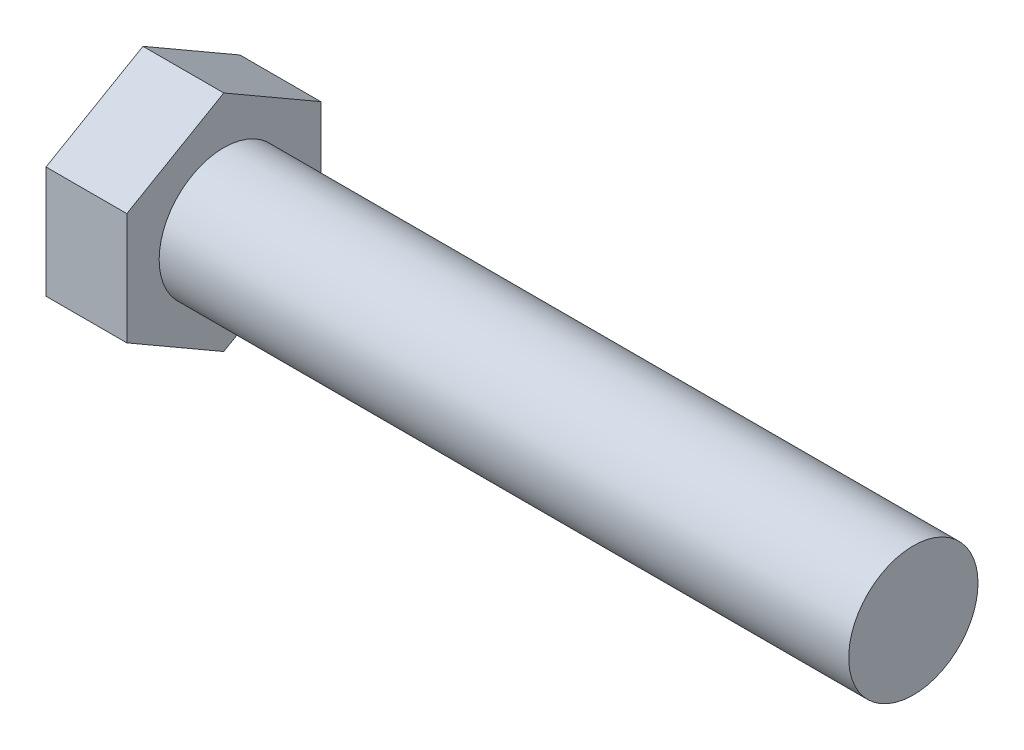
ISO-10303-21;
HEADER;
FILE_DESCRIPTION(('STEP AP214'),'2;1');
FILE_NAME('part.step','',(''),(''),'','','');
FILE_SCHEMA(('AUTOMOTIVE_DESIGN { 1 0 10303 214 1 1 1 1 }'));
ENDSEC;
DATA;
#1=APPLICATION_CONTEXT('core data for automotive mechanical design processes');
#2=APPLICATION_PROTOCOL_DEFINITION('international standard','automotive_design',2000,#1);
#3=PRODUCT_CONTEXT('',#1,'mechanical');
#4=PRODUCT('Part','Part','',(#3));
#5=PRODUCT_RELATED_PRODUCT_CATEGORY('part','',(#4));
#6=PRODUCT_DEFINITION_FORMATION('','',#4);
#7=PRODUCT_DEFINITION_CONTEXT('part definition',#1,'design');
#8=PRODUCT_DEFINITION('design','',#6,#7);
#9=PRODUCT_DEFINITION_SHAPE('','',#8);
#10=(LENGTH_UNIT() NAMED_UNIT(*) SI_UNIT(.MILLI.,.METRE.));
#11=(NAMED_UNIT(*) PLANE_ANGLE_UNIT() SI_UNIT($,.RADIAN.));
#12=(NAMED_UNIT(*) SI_UNIT($,.STERADIAN.) SOLID_ANGLE_UNIT());
#13=UNCERTAINTY_MEASURE_WITH_UNIT(LENGTH_MEASURE(1.E-05),#10,'distance_accuracy_value','');
#14=(GEOMETRIC_REPRESENTATION_CONTEXT(3) GLOBAL_UNCERTAINTY_ASSIGNED_CONTEXT((#13)) GLOBAL_UNIT_ASSIGNED_CONTEXT((#10,
#11,#12)) REPRESENTATION_CONTEXT('',''));
#15=CARTESIAN_POINT('',(0.,0.,0.));
#16=DIRECTION('',(0.,0.,1.));
#17=DIRECTION('',(1.,0.,0.));
#18=AXIS2_PLACEMENT_3D('',#15,#16,#17);
#19=CARTESIAN_POINT('',(-22.4234375,0.,0.));
#20=DIRECTION('',(1.,0.,0.));
#21=DIRECTION('',(0.,0.,-1.));
#22=AXIS2_PLACEMENT_3D('',#19,#20,#21);
#23=CYLINDRICAL_SURFACE('',#22,4.7625);
#24=CARTESIAN_POINT('',(-22.4234375,0.,0.));
#25=DIRECTION('',(-1.,0.,0.));
#26=DIRECTION('',(0.,0.,1.));
#27=AXIS2_PLACEMENT_3D('',#24,#25,#26);
#28=CIRCLE('',#27,4.7625);
#29=CARTESIAN_POINT('',(-22.4234375,0.,4.7625));
#30=VERTEX_POINT('',#29);
#31=EDGE_CURVE('E55',#30,#30,#28,.F.);
#32=ORIENTED_EDGE('',*,*,#31,.T.);
#33=EDGE_LOOP('',(#32));
#34=FACE_BOUND('',#33,.T.);
#35=CARTESIAN_POINT('',(28.3765625,0.,0.));
#36=DIRECTION('',(1.,0.,0.));
#37=DIRECTION('',(0.,0.,-1.));
#38=AXIS2_PLACEMENT_3D('',#35,#36,#37);
#39=CIRCLE('',#38,4.7625);
#40=CARTESIAN_POINT('',(28.3765625,0.,-4.7625));
#41=VERTEX_POINT('',#40);
#42=EDGE_CURVE('E11',#41,#41,#39,.T.);
#43=ORIENTED_EDGE('',*,*,#42,.F.);
#44=EDGE_LOOP('',(#43));
#45=FACE_BOUND('',#44,.T.);
#46=ADVANCED_FACE('F47',(#34,#45),#23,.T.);
#47=CARTESIAN_POINT('',(28.3765625,0.,0.));
#48=DIRECTION('',(1.,0.,0.));
#49=DIRECTION('',(0.,0.,-1.));
#50=AXIS2_PLACEMENT_3D('',#47,#48,#49);
#51=PLANE('',#50);
#52=ORIENTED_EDGE('',*,*,#42,.T.);
#53=EDGE_LOOP('',(#52));
#54=FACE_BOUND('',#53,.T.);
#55=ADVANCED_FACE('F174',(#54),#51,.T.);
#56=CARTESIAN_POINT('',(-28.3765625,-4.12444598552339,7.14375));
#57=DIRECTION('',(0.,0.,-1.));
#58=DIRECTION('',(0.,1.,0.));
#59=AXIS2_PLACEMENT_3D('',#56,#57,#58);
#60=PLANE('',#59);
#61=DIRECTION('',(0.,1.,0.));
#62=VECTOR('',#61,1.);
#63=CARTESIAN_POINT('',(-22.4234375,-4.12444598552339,7.14375));
#64=LINE('',#63,#62);
#65=CARTESIAN_POINT('',(-22.4234375,-4.12444598552339,7.14375));
#66=VERTEX_POINT('',#65);
#67=CARTESIAN_POINT('',(-22.4234375,4.12444598552339,7.14375));
#68=VERTEX_POINT('',#67);
#69=EDGE_CURVE('E132',#66,#68,#64,.T.);
#70=ORIENTED_EDGE('',*,*,#69,.T.);
#71=DIRECTION('',(1.,0.,0.));
#72=VECTOR('',#71,1.);
#73=CARTESIAN_POINT('',(-28.3765625,4.12444598552339,7.14375));
#74=LINE('',#73,#72);
#75=CARTESIAN_POINT('',(-28.3765625,4.12444598552339,7.14375));
#76=VERTEX_POINT('',#75);
#77=EDGE_CURVE('E149',#76,#68,#74,.T.);
#78=ORIENTED_EDGE('',*,*,#77,.F.);
#79=DIRECTION('',(0.,1.,0.));
#80=VECTOR('',#79,1.);
#81=CARTESIAN_POINT('',(-28.3765625,-4.12444598552339,7.14375));
#82=LINE('',#81,#80);
#83=CARTESIAN_POINT('',(-28.3765625,-4.12444598552339,7.14375));
#84=VERTEX_POINT('',#83);
#85=EDGE_CURVE('E142',#84,#76,#82,.T.);
#86=ORIENTED_EDGE('',*,*,#85,.F.);
#87=DIRECTION('',(1.,0.,0.));
#88=VECTOR('',#87,1.);
#89=CARTESIAN_POINT('',(-28.3765625,-4.12444598552339,7.14375));
#90=LINE('',#89,#88);
#91=EDGE_CURVE('E128',#84,#66,#90,.T.);
#92=ORIENTED_EDGE('',*,*,#91,.T.);
#93=EDGE_LOOP('',(#70,#78,#86,#92));
#94=FACE_BOUND('',#93,.T.);
#95=ADVANCED_FACE('F163',(#94),#60,.F.);
#96=CARTESIAN_POINT('',(-28.3765625,4.12444598552339,7.14375));
#97=DIRECTION('',(0.,-0.866025403784439,-0.5));
#98=DIRECTION('',(0.,0.5,-0.866025403784439));
#99=AXIS2_PLACEMENT_3D('',#96,#97,#98);
#100=PLANE('',#99);
#101=DIRECTION('',(0.,0.5,-0.866025403784439));
#102=VECTOR('',#101,1.);
#103=CARTESIAN_POINT('',(-22.4234375,4.12444598552339,7.14375));
#104=LINE('',#103,#102);
#105=CARTESIAN_POINT('',(-22.4234375,8.24889197104678,0.));
#106=VERTEX_POINT('',#105);
#107=EDGE_CURVE('E135',#68,#106,#104,.T.);
#108=ORIENTED_EDGE('',*,*,#107,.T.);
#109=DIRECTION('',(1.,0.,0.));
#110=VECTOR('',#109,1.);
#111=CARTESIAN_POINT('',(-28.3765625,8.24889197104678,0.));
#112=LINE('',#111,#110);
#113=CARTESIAN_POINT('',(-28.3765625,8.24889197104678,0.));
#114=VERTEX_POINT('',#113);
#115=EDGE_CURVE('E146',#114,#106,#112,.T.);
#116=ORIENTED_EDGE('',*,*,#115,.F.);
#117=DIRECTION('',(0.,0.5,-0.866025403784439));
#118=VECTOR('',#117,1.);
#119=CARTESIAN_POINT('',(-28.3765625,4.12444598552339,7.14375));
#120=LINE('',#119,#118);
#121=EDGE_CURVE('E101',#76,#114,#120,.T.);
#122=ORIENTED_EDGE('',*,*,#121,.F.);
#123=ORIENTED_EDGE('',*,*,#77,.T.);
#124=EDGE_LOOP('',(#108,#116,#122,#123));
#125=FACE_BOUND('',#124,.T.);
#126=ADVANCED_FACE('F181',(#125),#100,.F.);
#127=CARTESIAN_POINT('',(-28.3765625,8.24889197104678,0.));
#128=DIRECTION('',(0.,-0.866025403784439,0.5));
#129=DIRECTION('',(0.,-0.5,-0.866025403784439));
#130=AXIS2_PLACEMENT_3D('',#127,#128,#129);
#131=PLANE('',#130);
#132=DIRECTION('',(0.,-0.5,-0.866025403784439));
#133=VECTOR('',#132,1.);
#134=CARTESIAN_POINT('',(-22.4234375,8.24889197104678,0.));
#135=LINE('',#134,#133);
#136=CARTESIAN_POINT('',(-22.4234375,4.12444598552339,-7.14375));
#137=VERTEX_POINT('',#136);
#138=EDGE_CURVE('E137',#106,#137,#135,.T.);
#139=ORIENTED_EDGE('',*,*,#138,.T.);
#140=DIRECTION('',(1.,0.,0.));
#141=VECTOR('',#140,1.);
#142=CARTESIAN_POINT('',(-28.3765625,4.12444598552339,-7.14375));
#143=LINE('',#142,#141);
#144=CARTESIAN_POINT('',(-28.3765625,4.12444598552339,-7.14375));
#145=VERTEX_POINT('',#144);
#146=EDGE_CURVE('E123',#145,#137,#143,.T.);
#147=ORIENTED_EDGE('',*,*,#146,.F.);
#148=DIRECTION('',(0.,-0.5,-0.866025403784439));
#149=VECTOR('',#148,1.);
#150=CARTESIAN_POINT('',(-28.3765625,8.24889197104678,0.));
#151=LINE('',#150,#149);
#152=EDGE_CURVE('E114',#114,#145,#151,.T.);
#153=ORIENTED_EDGE('',*,*,#152,.F.);
#154=ORIENTED_EDGE('',*,*,#115,.T.);
#155=EDGE_LOOP('',(#139,#147,#153,#154));
#156=FACE_BOUND('',#155,.T.);
#157=ADVANCED_FACE('F186',(#156),#131,.F.);
#158=CARTESIAN_POINT('',(-28.3765625,4.12444598552339,-7.14375));
#159=DIRECTION('',(0.,0.,1.));
#160=DIRECTION('',(0.,-1.,0.));
#161=AXIS2_PLACEMENT_3D('',#158,#159,#160);
#162=PLANE('',#161);
#163=DIRECTION('',(0.,-1.,0.));
#164=VECTOR('',#163,1.);
#165=CARTESIAN_POINT('',(-22.4234375,4.12444598552339,-7.14375));
#166=LINE('',#165,#164);
#167=CARTESIAN_POINT('',(-22.4234375,-4.12444598552339,-7.14375));
#168=VERTEX_POINT('',#167);
#169=EDGE_CURVE('E122',#137,#168,#166,.T.);
#170=ORIENTED_EDGE('',*,*,#169,.T.);
#171=DIRECTION('',(1.,0.,0.));
#172=VECTOR('',#171,1.);
#173=CARTESIAN_POINT('',(-28.3765625,-4.12444598552339,-7.14375));
#174=LINE('',#173,#172);
#175=CARTESIAN_POINT('',(-28.3765625,-4.12444598552339,-7.14375));
#176=VERTEX_POINT('',#175);
#177=EDGE_CURVE('E119',#176,#168,#174,.T.);
#178=ORIENTED_EDGE('',*,*,#177,.F.);
#179=DIRECTION('',(0.,-1.,0.));
#180=VECTOR('',#179,1.);
#181=CARTESIAN_POINT('',(-28.3765625,4.12444598552339,-7.14375));
#182=LINE('',#181,#180);
#183=EDGE_CURVE('E108',#145,#176,#182,.T.);
#184=ORIENTED_EDGE('',*,*,#183,.F.);
#185=ORIENTED_EDGE('',*,*,#146,.T.);
#186=EDGE_LOOP('',(#170,#178,#184,#185));
#187=FACE_BOUND('',#186,.T.);
#188=ADVANCED_FACE('F120',(#187),#162,.F.);
#189=CARTESIAN_POINT('',(-28.3765625,-4.12444598552339,-7.14375));
#190=DIRECTION('',(0.,0.866025403784439,0.5));
#191=DIRECTION('',(0.,-0.5,0.866025403784439));
#192=AXIS2_PLACEMENT_3D('',#189,#190,#191);
#193=PLANE('',#192);
#194=DIRECTION('',(0.,-0.5,0.866025403784439));
#195=VECTOR('',#194,1.);
#196=CARTESIAN_POINT('',(-22.4234375,-4.12444598552339,-7.14375));
#197=LINE('',#196,#195);
#198=CARTESIAN_POINT('',(-22.4234375,-8.24889197104678,0.));
#199=VERTEX_POINT('',#198);
#200=EDGE_CURVE('E86',#168,#199,#197,.T.);
#201=ORIENTED_EDGE('',*,*,#200,.T.);
#202=DIRECTION('',(1.,0.,0.));
#203=VECTOR('',#202,1.);
#204=CARTESIAN_POINT('',(-28.3765625,-8.24889197104678,0.));
#205=LINE('',#204,#203);
#206=CARTESIAN_POINT('',(-28.3765625,-8.24889197104678,0.));
#207=VERTEX_POINT('',#206);
#208=EDGE_CURVE('E124',#207,#199,#205,.T.);
#209=ORIENTED_EDGE('',*,*,#208,.F.);
#210=DIRECTION('',(0.,-0.5,0.866025403784439));
#211=VECTOR('',#210,1.);
#212=CARTESIAN_POINT('',(-28.3765625,-4.12444598552339,-7.14375));
#213=LINE('',#212,#211);
#214=EDGE_CURVE('E112',#176,#207,#213,.T.);
#215=ORIENTED_EDGE('',*,*,#214,.F.);
#216=ORIENTED_EDGE('',*,*,#177,.T.);
#217=EDGE_LOOP('',(#201,#209,#215,#216));
#218=FACE_BOUND('',#217,.T.);
#219=ADVANCED_FACE('F126',(#218),#193,.F.);
#220=CARTESIAN_POINT('',(-28.3765625,-8.24889197104678,0.));
#221=DIRECTION('',(0.,0.866025403784439,-0.5));
#222=DIRECTION('',(0.,0.5,0.866025403784439));
#223=AXIS2_PLACEMENT_3D('',#220,#221,#222);
#224=PLANE('',#223);
#225=DIRECTION('',(0.,0.5,0.866025403784439));
#226=VECTOR('',#225,1.);
#227=CARTESIAN_POINT('',(-22.4234375,-8.24889197104678,0.));
#228=LINE('',#227,#226);
#229=EDGE_CURVE('E92',#199,#66,#228,.T.);
#230=ORIENTED_EDGE('',*,*,#229,.T.);
#231=ORIENTED_EDGE('',*,*,#91,.F.);
#232=DIRECTION('',(0.,0.5,0.866025403784439));
#233=VECTOR('',#232,1.);
#234=CARTESIAN_POINT('',(-28.3765625,-8.24889197104678,0.));
#235=LINE('',#234,#233);
#236=EDGE_CURVE('E63',#207,#84,#235,.T.);
#237=ORIENTED_EDGE('',*,*,#236,.F.);
#238=ORIENTED_EDGE('',*,*,#208,.T.);
#239=EDGE_LOOP('',(#230,#231,#237,#238));
#240=FACE_BOUND('',#239,.T.);
#241=ADVANCED_FACE('F165',(#240),#224,.F.);
#242=CARTESIAN_POINT('',(-28.3765625,4.12444598552339,7.14375));
#243=DIRECTION('',(-1.,0.,0.));
#244=DIRECTION('',(0.,0.,1.));
#245=AXIS2_PLACEMENT_3D('',#242,#243,#244);
#246=PLANE('',#245);
#247=ORIENTED_EDGE('',*,*,#85,.T.);
#248=ORIENTED_EDGE('',*,*,#121,.T.);
#249=ORIENTED_EDGE('',*,*,#152,.T.);
#250=ORIENTED_EDGE('',*,*,#183,.T.);
#251=ORIENTED_EDGE('',*,*,#214,.T.);
#252=ORIENTED_EDGE('',*,*,#236,.T.);
#253=EDGE_LOOP('',(#247,#248,#249,#250,#251,#252));
#254=FACE_BOUND('',#253,.T.);
#255=ADVANCED_FACE('F110',(#254),#246,.T.);
#256=CARTESIAN_POINT('',(-22.4234375,4.12444598552339,7.14375));
#257=DIRECTION('',(-1.,0.,0.));
#258=DIRECTION('',(0.,0.,1.));
#259=AXIS2_PLACEMENT_3D('',#256,#257,#258);
#260=PLANE('',#259);
#261=ORIENTED_EDGE('',*,*,#31,.F.);
#262=EDGE_LOOP('',(#261));
#263=FACE_BOUND('',#262,.T.);
#264=ORIENTED_EDGE('',*,*,#69,.F.);
#265=ORIENTED_EDGE('',*,*,#229,.F.);
#266=ORIENTED_EDGE('',*,*,#200,.F.);
#267=ORIENTED_EDGE('',*,*,#169,.F.);
#268=ORIENTED_EDGE('',*,*,#138,.F.);
#269=ORIENTED_EDGE('',*,*,#107,.F.);
#270=EDGE_LOOP('',(#264,#265,#266,#267,#268,#269));
#271=FACE_BOUND('',#270,.T.);
#272=ADVANCED_FACE('F155',(#263,#271),#260,.F.);
#273=CLOSED_SHELL('',(#46,#55,#95,#126,#157,#188,#219,#241,#255,#272));
#274=MANIFOLD_SOLID_BREP('B2',#273);
#275=ADVANCED_BREP_SHAPE_REPRESENTATION('',(#18,#274),#14);
#276=SHAPE_DEFINITION_REPRESENTATION(#9,#275);
ENDSEC;
END-ISO-10303-21;
